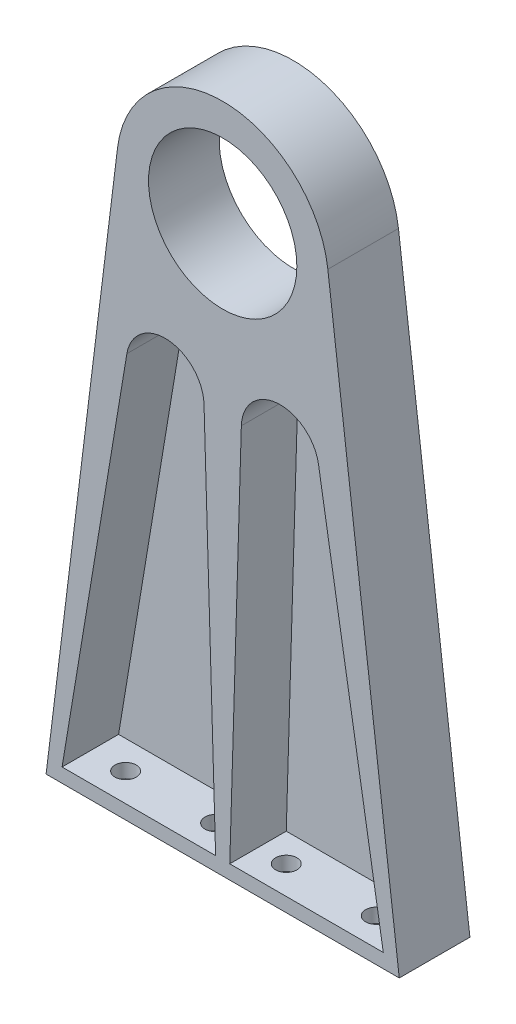
ISO-10303-21;
HEADER;
FILE_DESCRIPTION(('STEP AP214'),'2;1');
FILE_NAME('part.step','',(''),(''),'','','');
FILE_SCHEMA(('AUTOMOTIVE_DESIGN { 1 0 10303 214 1 1 1 1 }'));
ENDSEC;
DATA;
#1=APPLICATION_CONTEXT('core data for automotive mechanical design processes');
#2=APPLICATION_PROTOCOL_DEFINITION('international standard','automotive_design',2000,#1);
#3=PRODUCT_CONTEXT('',#1,'mechanical');
#4=PRODUCT('Part','Part','',(#3));
#5=PRODUCT_RELATED_PRODUCT_CATEGORY('part','',(#4));
#6=PRODUCT_DEFINITION_FORMATION('','',#4);
#7=PRODUCT_DEFINITION_CONTEXT('part definition',#1,'design');
#8=PRODUCT_DEFINITION('design','',#6,#7);
#9=PRODUCT_DEFINITION_SHAPE('','',#8);
#10=(LENGTH_UNIT() NAMED_UNIT(*) SI_UNIT(.MILLI.,.METRE.));
#11=(NAMED_UNIT(*) PLANE_ANGLE_UNIT() SI_UNIT($,.RADIAN.));
#12=(NAMED_UNIT(*) SI_UNIT($,.STERADIAN.) SOLID_ANGLE_UNIT());
#13=UNCERTAINTY_MEASURE_WITH_UNIT(LENGTH_MEASURE(1.E-05),#10,'distance_accuracy_value','');
#14=(GEOMETRIC_REPRESENTATION_CONTEXT(3) GLOBAL_UNCERTAINTY_ASSIGNED_CONTEXT((#13)) GLOBAL_UNIT_ASSIGNED_CONTEXT((#10,
#11,#12)) REPRESENTATION_CONTEXT('',''));
#15=CARTESIAN_POINT('',(0.,0.,0.));
#16=DIRECTION('',(0.,0.,1.));
#17=DIRECTION('',(1.,0.,0.));
#18=AXIS2_PLACEMENT_3D('',#15,#16,#17);
#19=CARTESIAN_POINT('',(5.02028973947688E-12,80.,10.));
#20=DIRECTION('',(0.,0.,1.));
#21=DIRECTION('',(1.,0.,0.));
#22=AXIS2_PLACEMENT_3D('',#19,#20,#21);
#23=PLANE('',#22);
#24=DIRECTION('',(1.,0.,0.));
#25=VECTOR('',#24,1.);
#26=CARTESIAN_POINT('',(-22.7376397365819,2.,10.));
#27=LINE('',#26,#25);
#28=CARTESIAN_POINT('',(-22.7376397365819,2.,10.));
#29=VERTEX_POINT('',#28);
#30=CARTESIAN_POINT('',(-1.00000000000001,2.00000000000002,10.));
#31=VERTEX_POINT('',#30);
#32=EDGE_CURVE('E49',#29,#31,#27,.T.);
#33=ORIENTED_EDGE('',*,*,#32,.F.);
#34=DIRECTION('',(-0.1637429725311,-0.986503035447271,0.));
#35=VECTOR('',#34,1.);
#36=CARTESIAN_POINT('',(-13.5649705563839,57.2626219589381,10.));
#37=LINE('',#36,#35);
#38=CARTESIAN_POINT('',(-13.5649705563839,57.2626219589381,10.));
#39=VERTEX_POINT('',#38);
#40=EDGE_CURVE('E143',#39,#29,#37,.T.);
#41=ORIENTED_EDGE('',*,*,#40,.F.);
#42=CARTESIAN_POINT('',(-8.13920386142391,56.3620356100171,10.));
#43=DIRECTION('',(0.,0.,1.));
#44=DIRECTION('',(1.,0.,0.));
#45=AXIS2_PLACEMENT_3D('',#42,#43,#44);
#46=CIRCLE('',#45,5.5);
#47=CARTESIAN_POINT('',(-2.64169495751029,56.5275525317818,10.));
#48=VERTEX_POINT('',#47);
#49=EDGE_CURVE('E146',#48,#39,#46,.T.);
#50=ORIENTED_EDGE('',*,*,#49,.F.);
#51=DIRECTION('',(-0.0300939857753978,0.99954707343884,0.));
#52=VECTOR('',#51,1.);
#53=CARTESIAN_POINT('',(-2.64169495751029,56.5275525317818,10.));
#54=LINE('',#53,#52);
#55=EDGE_CURVE('E155',#31,#48,#54,.T.);
#56=ORIENTED_EDGE('',*,*,#55,.F.);
#57=EDGE_LOOP('',(#33,#41,#50,#56));
#58=FACE_BOUND('',#57,.T.);
#59=DIRECTION('',(1.,0.,0.));
#60=VECTOR('',#59,1.);
#61=CARTESIAN_POINT('',(1.,2.,10.));
#62=LINE('',#61,#60);
#63=CARTESIAN_POINT('',(1.,2.,10.));
#64=VERTEX_POINT('',#63);
#65=CARTESIAN_POINT('',(22.7376397365822,2.,10.));
#66=VERTEX_POINT('',#65);
#67=EDGE_CURVE('E57',#64,#66,#62,.T.);
#68=ORIENTED_EDGE('',*,*,#67,.F.);
#69=DIRECTION('',(-0.0300939857755821,-0.999547073438835,0.));
#70=VECTOR('',#69,1.);
#71=CARTESIAN_POINT('',(2.64169495752037,56.5275525317828,10.));
#72=LINE('',#71,#70);
#73=CARTESIAN_POINT('',(2.64169495752037,56.5275525317828,10.));
#74=VERTEX_POINT('',#73);
#75=EDGE_CURVE('E169',#74,#64,#72,.T.);
#76=ORIENTED_EDGE('',*,*,#75,.F.);
#77=CARTESIAN_POINT('',(8.13920386143396,56.3620356100171,10.));
#78=DIRECTION('',(0.,0.,1.));
#79=DIRECTION('',(1.,0.,0.));
#80=AXIS2_PLACEMENT_3D('',#77,#78,#79);
#81=CIRCLE('',#80,5.5);
#82=CARTESIAN_POINT('',(13.5649705563941,57.2626219589372,10.));
#83=VERTEX_POINT('',#82);
#84=EDGE_CURVE('E183',#83,#74,#81,.T.);
#85=ORIENTED_EDGE('',*,*,#84,.F.);
#86=DIRECTION('',(-0.16374297253093,0.986503035447299,0.));
#87=VECTOR('',#86,1.);
#88=CARTESIAN_POINT('',(13.5649705563941,57.2626219589372,10.));
#89=LINE('',#88,#87);
#90=EDGE_CURVE('E180',#66,#83,#89,.T.);
#91=ORIENTED_EDGE('',*,*,#90,.F.);
#92=EDGE_LOOP('',(#68,#76,#85,#91));
#93=FACE_BOUND('',#92,.T.);
#94=DIRECTION('',(-0.122640969794791,0.992451103343532,0.));
#95=VECTOR('',#94,1.);
#96=CARTESIAN_POINT('',(25.,0.,10.));
#97=LINE('',#96,#95);
#98=CARTESIAN_POINT('',(25.,0.,10.));
#99=VERTEX_POINT('',#98);
#100=CARTESIAN_POINT('',(14.886766550158,81.8396145469219,10.));
#101=VERTEX_POINT('',#100);
#102=EDGE_CURVE('E202',#99,#101,#97,.T.);
#103=ORIENTED_EDGE('',*,*,#102,.T.);
#104=CARTESIAN_POINT('',(5.02028973947688E-12,80.,10.));
#105=DIRECTION('',(0.,0.,1.));
#106=DIRECTION('',(1.,0.,0.));
#107=AXIS2_PLACEMENT_3D('',#104,#105,#106);
#108=CIRCLE('',#107,15.);
#109=CARTESIAN_POINT('',(-14.8867665501477,81.8396145469237,10.));
#110=VERTEX_POINT('',#109);
#111=EDGE_CURVE('E205',#101,#110,#108,.T.);
#112=ORIENTED_EDGE('',*,*,#111,.T.);
#113=DIRECTION('',(-0.122640969794911,-0.992451103343517,0.));
#114=VECTOR('',#113,1.);
#115=CARTESIAN_POINT('',(-25.,0.,10.));
#116=LINE('',#115,#114);
#117=CARTESIAN_POINT('',(-25.,0.,10.));
#118=VERTEX_POINT('',#117);
#119=EDGE_CURVE('E208',#110,#118,#116,.T.);
#120=ORIENTED_EDGE('',*,*,#119,.T.);
#121=DIRECTION('',(1.,0.,0.));
#122=VECTOR('',#121,1.);
#123=CARTESIAN_POINT('',(-25.,0.,10.));
#124=LINE('',#123,#122);
#125=EDGE_CURVE('E210',#118,#99,#124,.T.);
#126=ORIENTED_EDGE('',*,*,#125,.T.);
#127=EDGE_LOOP('',(#103,#112,#120,#126));
#128=FACE_BOUND('',#127,.T.);
#129=CARTESIAN_POINT('',(5.02028973947688E-12,80.,10.));
#130=DIRECTION('',(0.,0.,1.));
#131=DIRECTION('',(1.,0.,0.));
#132=AXIS2_PLACEMENT_3D('',#129,#130,#131);
#133=CIRCLE('',#132,10.4999999999952);
#134=CARTESIAN_POINT('',(10.5000000000002,80.,10.));
#135=VERTEX_POINT('',#134);
#136=EDGE_CURVE('E196',#135,#135,#133,.T.);
#137=ORIENTED_EDGE('',*,*,#136,.F.);
#138=EDGE_LOOP('',(#137));
#139=FACE_BOUND('',#138,.T.);
#140=ADVANCED_FACE('F34',(#58,#93,#128,#139),#23,.T.);
#141=CARTESIAN_POINT('',(5.02028973947688E-12,80.,0.));
#142=DIRECTION('',(0.,0.,1.));
#143=DIRECTION('',(1.,0.,0.));
#144=AXIS2_PLACEMENT_3D('',#141,#142,#143);
#145=PLANE('',#144);
#146=DIRECTION('',(-0.122640969794791,0.992451103343532,0.));
#147=VECTOR('',#146,1.);
#148=CARTESIAN_POINT('',(25.,0.,0.));
#149=LINE('',#148,#147);
#150=CARTESIAN_POINT('',(25.,0.,0.));
#151=VERTEX_POINT('',#150);
#152=CARTESIAN_POINT('',(14.886766550158,81.8396145469219,0.));
#153=VERTEX_POINT('',#152);
#154=EDGE_CURVE('E199',#151,#153,#149,.T.);
#155=ORIENTED_EDGE('',*,*,#154,.F.);
#156=DIRECTION('',(1.,0.,0.));
#157=VECTOR('',#156,1.);
#158=CARTESIAN_POINT('',(-25.,0.,0.));
#159=LINE('',#158,#157);
#160=CARTESIAN_POINT('',(-25.,0.,0.));
#161=VERTEX_POINT('',#160);
#162=EDGE_CURVE('E206',#161,#151,#159,.T.);
#163=ORIENTED_EDGE('',*,*,#162,.F.);
#164=DIRECTION('',(-0.122640969794911,-0.992451103343517,0.));
#165=VECTOR('',#164,1.);
#166=CARTESIAN_POINT('',(-25.,0.,0.));
#167=LINE('',#166,#165);
#168=CARTESIAN_POINT('',(-14.8867665501477,81.8396145469237,0.));
#169=VERTEX_POINT('',#168);
#170=EDGE_CURVE('E217',#169,#161,#167,.T.);
#171=ORIENTED_EDGE('',*,*,#170,.F.);
#172=CARTESIAN_POINT('',(5.02028973947688E-12,80.,0.));
#173=DIRECTION('',(0.,0.,1.));
#174=DIRECTION('',(1.,0.,0.));
#175=AXIS2_PLACEMENT_3D('',#172,#173,#174);
#176=CIRCLE('',#175,15.);
#177=EDGE_CURVE('E215',#153,#169,#176,.T.);
#178=ORIENTED_EDGE('',*,*,#177,.F.);
#179=EDGE_LOOP('',(#155,#163,#171,#178));
#180=FACE_BOUND('',#179,.T.);
#181=CARTESIAN_POINT('',(5.02028973947688E-12,80.,0.));
#182=DIRECTION('',(0.,0.,1.));
#183=DIRECTION('',(1.,0.,0.));
#184=AXIS2_PLACEMENT_3D('',#181,#182,#183);
#185=CIRCLE('',#184,10.4999999999952);
#186=CARTESIAN_POINT('',(10.5000000000002,80.,0.));
#187=VERTEX_POINT('',#186);
#188=EDGE_CURVE('E190',#187,#187,#185,.T.);
#189=ORIENTED_EDGE('',*,*,#188,.T.);
#190=EDGE_LOOP('',(#189));
#191=FACE_BOUND('',#190,.T.);
#192=ADVANCED_FACE('F235',(#180,#191),#145,.F.);
#193=CARTESIAN_POINT('',(25.,0.,10.));
#194=DIRECTION('',(-0.992451103343532,-0.122640969794791,0.));
#195=DIRECTION('',(0.122640969794791,-0.992451103343532,0.));
#196=AXIS2_PLACEMENT_3D('',#193,#194,#195);
#197=PLANE('',#196);
#198=ORIENTED_EDGE('',*,*,#154,.T.);
#199=DIRECTION('',(0.,0.,-1.));
#200=VECTOR('',#199,1.);
#201=CARTESIAN_POINT('',(14.886766550158,81.8396145469219,10.));
#202=LINE('',#201,#200);
#203=EDGE_CURVE('E11',#101,#153,#202,.T.);
#204=ORIENTED_EDGE('',*,*,#203,.F.);
#205=ORIENTED_EDGE('',*,*,#102,.F.);
#206=DIRECTION('',(0.,0.,-1.));
#207=VECTOR('',#206,1.);
#208=CARTESIAN_POINT('',(25.,0.,10.));
#209=LINE('',#208,#207);
#210=EDGE_CURVE('E212',#99,#151,#209,.T.);
#211=ORIENTED_EDGE('',*,*,#210,.T.);
#212=EDGE_LOOP('',(#198,#204,#205,#211));
#213=FACE_BOUND('',#212,.T.);
#214=ADVANCED_FACE('F36',(#213),#197,.F.);
#215=CARTESIAN_POINT('',(5.02028973947688E-12,80.,10.));
#216=DIRECTION('',(0.,0.,-1.));
#217=DIRECTION('',(-1.,0.,0.));
#218=AXIS2_PLACEMENT_3D('',#215,#216,#217);
#219=CYLINDRICAL_SURFACE('',#218,15.);
#220=ORIENTED_EDGE('',*,*,#177,.T.);
#221=DIRECTION('',(0.,0.,-1.));
#222=VECTOR('',#221,1.);
#223=CARTESIAN_POINT('',(-14.8867665501477,81.8396145469237,10.));
#224=LINE('',#223,#222);
#225=EDGE_CURVE('E42',#110,#169,#224,.T.);
#226=ORIENTED_EDGE('',*,*,#225,.F.);
#227=ORIENTED_EDGE('',*,*,#111,.F.);
#228=ORIENTED_EDGE('',*,*,#203,.T.);
#229=EDGE_LOOP('',(#220,#226,#227,#228));
#230=FACE_BOUND('',#229,.T.);
#231=ADVANCED_FACE('F246',(#230),#219,.T.);
#232=CARTESIAN_POINT('',(-25.,0.,10.));
#233=DIRECTION('',(0.992451103343517,-0.122640969794911,0.));
#234=DIRECTION('',(0.122640969794911,0.992451103343517,0.));
#235=AXIS2_PLACEMENT_3D('',#232,#233,#234);
#236=PLANE('',#235);
#237=ORIENTED_EDGE('',*,*,#170,.T.);
#238=DIRECTION('',(0.,0.,-1.));
#239=VECTOR('',#238,1.);
#240=CARTESIAN_POINT('',(-25.,0.,10.));
#241=LINE('',#240,#239);
#242=EDGE_CURVE('E222',#118,#161,#241,.T.);
#243=ORIENTED_EDGE('',*,*,#242,.F.);
#244=ORIENTED_EDGE('',*,*,#119,.F.);
#245=ORIENTED_EDGE('',*,*,#225,.T.);
#246=EDGE_LOOP('',(#237,#243,#244,#245));
#247=FACE_BOUND('',#246,.T.);
#248=ADVANCED_FACE('F229',(#247),#236,.F.);
#249=CARTESIAN_POINT('',(-25.,0.,10.));
#250=DIRECTION('',(0.,1.,0.));
#251=DIRECTION('',(0.,0.,1.));
#252=AXIS2_PLACEMENT_3D('',#249,#250,#251);
#253=PLANE('',#252);
#254=CARTESIAN_POINT('',(-5.00000000000001,0.,6.));
#255=DIRECTION('',(0.,1.,0.));
#256=DIRECTION('',(-1.,0.,0.));
#257=AXIS2_PLACEMENT_3D('',#254,#255,#256);
#258=CIRCLE('',#257,1.5);
#259=CARTESIAN_POINT('',(-6.50000000000001,0.,6.));
#260=VERTEX_POINT('',#259);
#261=EDGE_CURVE('E275',#260,#260,#258,.T.);
#262=ORIENTED_EDGE('',*,*,#261,.T.);
#263=EDGE_LOOP('',(#262));
#264=FACE_BOUND('',#263,.T.);
#265=CARTESIAN_POINT('',(5.00000000000001,0.,6.));
#266=DIRECTION('',(0.,1.,0.));
#267=DIRECTION('',(-1.,0.,0.));
#268=AXIS2_PLACEMENT_3D('',#265,#266,#267);
#269=CIRCLE('',#268,1.5);
#270=CARTESIAN_POINT('',(3.5,0.,6.));
#271=VERTEX_POINT('',#270);
#272=EDGE_CURVE('E279',#271,#271,#269,.T.);
#273=ORIENTED_EDGE('',*,*,#272,.T.);
#274=EDGE_LOOP('',(#273));
#275=FACE_BOUND('',#274,.T.);
#276=CARTESIAN_POINT('',(17.74,0.,6.));
#277=DIRECTION('',(0.,1.,0.));
#278=DIRECTION('',(-1.,0.,0.));
#279=AXIS2_PLACEMENT_3D('',#276,#277,#278);
#280=CIRCLE('',#279,1.5);
#281=CARTESIAN_POINT('',(16.24,0.,6.));
#282=VERTEX_POINT('',#281);
#283=EDGE_CURVE('E283',#282,#282,#280,.T.);
#284=ORIENTED_EDGE('',*,*,#283,.T.);
#285=EDGE_LOOP('',(#284));
#286=FACE_BOUND('',#285,.T.);
#287=CARTESIAN_POINT('',(-17.74,0.,6.));
#288=DIRECTION('',(0.,1.,0.));
#289=DIRECTION('',(-1.,0.,0.));
#290=AXIS2_PLACEMENT_3D('',#287,#288,#289);
#291=CIRCLE('',#290,1.5);
#292=CARTESIAN_POINT('',(-19.24,0.,6.));
#293=VERTEX_POINT('',#292);
#294=EDGE_CURVE('E156',#293,#293,#291,.T.);
#295=ORIENTED_EDGE('',*,*,#294,.T.);
#296=EDGE_LOOP('',(#295));
#297=FACE_BOUND('',#296,.T.);
#298=ORIENTED_EDGE('',*,*,#162,.T.);
#299=ORIENTED_EDGE('',*,*,#210,.F.);
#300=ORIENTED_EDGE('',*,*,#125,.F.);
#301=ORIENTED_EDGE('',*,*,#242,.T.);
#302=EDGE_LOOP('',(#298,#299,#300,#301));
#303=FACE_BOUND('',#302,.T.);
#304=ADVANCED_FACE('F239',(#264,#275,#286,#297,#303),#253,.F.);
#305=CARTESIAN_POINT('',(5.02028973947688E-12,80.,10.));
#306=DIRECTION('',(0.,0.,-1.));
#307=DIRECTION('',(-1.,0.,0.));
#308=AXIS2_PLACEMENT_3D('',#305,#306,#307);
#309=CYLINDRICAL_SURFACE('',#308,10.4999999999952);
#310=ORIENTED_EDGE('',*,*,#136,.T.);
#311=EDGE_LOOP('',(#310));
#312=FACE_BOUND('',#311,.T.);
#313=ORIENTED_EDGE('',*,*,#188,.F.);
#314=EDGE_LOOP('',(#313));
#315=FACE_BOUND('',#314,.T.);
#316=ADVANCED_FACE('F262',(#312,#315),#309,.F.);
#317=CARTESIAN_POINT('',(1.,2.,2.));
#318=DIRECTION('',(0.,-1.,0.));
#319=DIRECTION('',(1.,0.,0.));
#320=AXIS2_PLACEMENT_3D('',#317,#318,#319);
#321=PLANE('',#320);
#322=CARTESIAN_POINT('',(5.,2.00000000000001,6.));
#323=DIRECTION('',(0.,1.,0.));
#324=DIRECTION('',(-1.,0.,0.));
#325=AXIS2_PLACEMENT_3D('',#322,#323,#324);
#326=CIRCLE('',#325,1.5);
#327=CARTESIAN_POINT('',(3.5,2.00000000000001,6.));
#328=VERTEX_POINT('',#327);
#329=EDGE_CURVE('E293',#328,#328,#326,.T.);
#330=ORIENTED_EDGE('',*,*,#329,.F.);
#331=EDGE_LOOP('',(#330));
#332=FACE_BOUND('',#331,.T.);
#333=CARTESIAN_POINT('',(17.74,2.00000000000001,6.));
#334=DIRECTION('',(0.,1.,0.));
#335=DIRECTION('',(-1.,0.,0.));
#336=AXIS2_PLACEMENT_3D('',#333,#334,#335);
#337=CIRCLE('',#336,1.5);
#338=CARTESIAN_POINT('',(16.24,2.00000000000001,6.));
#339=VERTEX_POINT('',#338);
#340=EDGE_CURVE('E289',#339,#339,#337,.T.);
#341=ORIENTED_EDGE('',*,*,#340,.F.);
#342=EDGE_LOOP('',(#341));
#343=FACE_BOUND('',#342,.T.);
#344=ORIENTED_EDGE('',*,*,#67,.T.);
#345=DIRECTION('',(0.,0.,1.));
#346=VECTOR('',#345,1.);
#347=CARTESIAN_POINT('',(22.7376397365822,2.,2.));
#348=LINE('',#347,#346);
#349=CARTESIAN_POINT('',(22.7376397365822,2.,2.));
#350=VERTEX_POINT('',#349);
#351=EDGE_CURVE('E178',#350,#66,#348,.T.);
#352=ORIENTED_EDGE('',*,*,#351,.F.);
#353=DIRECTION('',(1.,0.,0.));
#354=VECTOR('',#353,1.);
#355=CARTESIAN_POINT('',(1.,2.,2.));
#356=LINE('',#355,#354);
#357=CARTESIAN_POINT('',(1.,2.,2.));
#358=VERTEX_POINT('',#357);
#359=EDGE_CURVE('E165',#358,#350,#356,.T.);
#360=ORIENTED_EDGE('',*,*,#359,.F.);
#361=DIRECTION('',(0.,0.,1.));
#362=VECTOR('',#361,1.);
#363=CARTESIAN_POINT('',(1.,2.,2.));
#364=LINE('',#363,#362);
#365=EDGE_CURVE('E188',#358,#64,#364,.T.);
#366=ORIENTED_EDGE('',*,*,#365,.T.);
#367=EDGE_LOOP('',(#344,#352,#360,#366));
#368=FACE_BOUND('',#367,.T.);
#369=ADVANCED_FACE('F270',(#332,#343,#368),#321,.F.);
#370=CARTESIAN_POINT('',(2.64169495752037,56.5275525317828,2.));
#371=DIRECTION('',(-0.999547073438835,0.0300939857755821,0.));
#372=DIRECTION('',(-0.0300939857755821,-0.999547073438835,0.));
#373=AXIS2_PLACEMENT_3D('',#370,#371,#372);
#374=PLANE('',#373);
#375=ORIENTED_EDGE('',*,*,#75,.T.);
#376=ORIENTED_EDGE('',*,*,#365,.F.);
#377=DIRECTION('',(-0.0300939857755821,-0.999547073438835,0.));
#378=VECTOR('',#377,1.);
#379=CARTESIAN_POINT('',(2.64169495752037,56.5275525317828,2.));
#380=LINE('',#379,#378);
#381=CARTESIAN_POINT('',(2.64169495752037,56.5275525317828,2.));
#382=VERTEX_POINT('',#381);
#383=EDGE_CURVE('E175',#382,#358,#380,.T.);
#384=ORIENTED_EDGE('',*,*,#383,.F.);
#385=DIRECTION('',(0.,0.,1.));
#386=VECTOR('',#385,1.);
#387=CARTESIAN_POINT('',(2.64169495752037,56.5275525317828,2.));
#388=LINE('',#387,#386);
#389=EDGE_CURVE('E191',#382,#74,#388,.T.);
#390=ORIENTED_EDGE('',*,*,#389,.T.);
#391=EDGE_LOOP('',(#375,#376,#384,#390));
#392=FACE_BOUND('',#391,.T.);
#393=ADVANCED_FACE('F338',(#392),#374,.F.);
#394=CARTESIAN_POINT('',(8.13920386143396,56.3620356100171,2.));
#395=DIRECTION('',(0.,0.,1.));
#396=DIRECTION('',(1.,0.,0.));
#397=AXIS2_PLACEMENT_3D('',#394,#395,#396);
#398=CYLINDRICAL_SURFACE('',#397,5.5);
#399=ORIENTED_EDGE('',*,*,#84,.T.);
#400=ORIENTED_EDGE('',*,*,#389,.F.);
#401=CARTESIAN_POINT('',(8.13920386143396,56.3620356100171,2.));
#402=DIRECTION('',(0.,0.,1.));
#403=DIRECTION('',(1.,0.,0.));
#404=AXIS2_PLACEMENT_3D('',#401,#402,#403);
#405=CIRCLE('',#404,5.5);
#406=CARTESIAN_POINT('',(13.5649705563941,57.2626219589372,2.));
#407=VERTEX_POINT('',#406);
#408=EDGE_CURVE('E172',#407,#382,#405,.T.);
#409=ORIENTED_EDGE('',*,*,#408,.F.);
#410=DIRECTION('',(0.,0.,1.));
#411=VECTOR('',#410,1.);
#412=CARTESIAN_POINT('',(13.5649705563941,57.2626219589372,2.));
#413=LINE('',#412,#411);
#414=EDGE_CURVE('E193',#407,#83,#413,.T.);
#415=ORIENTED_EDGE('',*,*,#414,.T.);
#416=EDGE_LOOP('',(#399,#400,#409,#415));
#417=FACE_BOUND('',#416,.T.);
#418=ADVANCED_FACE('F341',(#417),#398,.F.);
#419=CARTESIAN_POINT('',(13.5649705563941,57.2626219589372,2.));
#420=DIRECTION('',(0.986503035447299,0.16374297253093,0.));
#421=DIRECTION('',(-0.16374297253093,0.986503035447299,0.));
#422=AXIS2_PLACEMENT_3D('',#419,#420,#421);
#423=PLANE('',#422);
#424=ORIENTED_EDGE('',*,*,#90,.T.);
#425=ORIENTED_EDGE('',*,*,#414,.F.);
#426=DIRECTION('',(-0.16374297253093,0.986503035447299,0.));
#427=VECTOR('',#426,1.);
#428=CARTESIAN_POINT('',(13.5649705563941,57.2626219589372,2.));
#429=LINE('',#428,#427);
#430=EDGE_CURVE('E168',#350,#407,#429,.T.);
#431=ORIENTED_EDGE('',*,*,#430,.F.);
#432=ORIENTED_EDGE('',*,*,#351,.T.);
#433=EDGE_LOOP('',(#424,#425,#431,#432));
#434=FACE_BOUND('',#433,.T.);
#435=ADVANCED_FACE('F336',(#434),#423,.F.);
#436=CARTESIAN_POINT('',(8.13920386143396,56.3620356100171,2.));
#437=DIRECTION('',(0.,0.,1.));
#438=DIRECTION('',(1.,0.,0.));
#439=AXIS2_PLACEMENT_3D('',#436,#437,#438);
#440=PLANE('',#439);
#441=ORIENTED_EDGE('',*,*,#359,.T.);
#442=ORIENTED_EDGE('',*,*,#430,.T.);
#443=ORIENTED_EDGE('',*,*,#408,.T.);
#444=ORIENTED_EDGE('',*,*,#383,.T.);
#445=EDGE_LOOP('',(#441,#442,#443,#444));
#446=FACE_BOUND('',#445,.T.);
#447=ADVANCED_FACE('F307',(#446),#440,.T.);
#448=CARTESIAN_POINT('',(-22.7376397365819,2.,2.));
#449=DIRECTION('',(0.,-1.,0.));
#450=DIRECTION('',(1.,0.,0.));
#451=AXIS2_PLACEMENT_3D('',#448,#449,#450);
#452=PLANE('',#451);
#453=CARTESIAN_POINT('',(-5.00000000000002,2.00000000000001,6.));
#454=DIRECTION('',(0.,1.,0.));
#455=DIRECTION('',(-1.,0.,0.));
#456=AXIS2_PLACEMENT_3D('',#453,#454,#455);
#457=CIRCLE('',#456,1.5);
#458=CARTESIAN_POINT('',(-6.50000000000002,2.00000000000001,6.));
#459=VERTEX_POINT('',#458);
#460=EDGE_CURVE('E297',#459,#459,#457,.T.);
#461=ORIENTED_EDGE('',*,*,#460,.F.);
#462=EDGE_LOOP('',(#461));
#463=FACE_BOUND('',#462,.T.);
#464=CARTESIAN_POINT('',(-17.74,2.,6.));
#465=DIRECTION('',(0.,1.,0.));
#466=DIRECTION('',(-1.,0.,0.));
#467=AXIS2_PLACEMENT_3D('',#464,#465,#466);
#468=CIRCLE('',#467,1.5);
#469=CARTESIAN_POINT('',(-19.24,2.,6.));
#470=VERTEX_POINT('',#469);
#471=EDGE_CURVE('E149',#470,#470,#468,.T.);
#472=ORIENTED_EDGE('',*,*,#471,.F.);
#473=EDGE_LOOP('',(#472));
#474=FACE_BOUND('',#473,.T.);
#475=ORIENTED_EDGE('',*,*,#32,.T.);
#476=DIRECTION('',(0.,0.,1.));
#477=VECTOR('',#476,1.);
#478=CARTESIAN_POINT('',(-1.00000000000001,2.00000000000001,2.));
#479=LINE('',#478,#477);
#480=CARTESIAN_POINT('',(-1.00000000000001,2.00000000000001,2.));
#481=VERTEX_POINT('',#480);
#482=EDGE_CURVE('E121',#481,#31,#479,.T.);
#483=ORIENTED_EDGE('',*,*,#482,.F.);
#484=DIRECTION('',(1.,0.,0.));
#485=VECTOR('',#484,1.);
#486=CARTESIAN_POINT('',(-22.7376397365819,2.,2.));
#487=LINE('',#486,#485);
#488=CARTESIAN_POINT('',(-22.7376397365819,2.,2.));
#489=VERTEX_POINT('',#488);
#490=EDGE_CURVE('E125',#489,#481,#487,.T.);
#491=ORIENTED_EDGE('',*,*,#490,.F.);
#492=DIRECTION('',(0.,0.,1.));
#493=VECTOR('',#492,1.);
#494=CARTESIAN_POINT('',(-22.7376397365819,2.,2.));
#495=LINE('',#494,#493);
#496=EDGE_CURVE('E160',#489,#29,#495,.T.);
#497=ORIENTED_EDGE('',*,*,#496,.T.);
#498=EDGE_LOOP('',(#475,#483,#491,#497));
#499=FACE_BOUND('',#498,.T.);
#500=ADVANCED_FACE('F123',(#463,#474,#499),#452,.F.);
#501=CARTESIAN_POINT('',(-13.5649705563839,57.2626219589381,2.));
#502=DIRECTION('',(-0.986503035447271,0.1637429725311,0.));
#503=DIRECTION('',(-0.1637429725311,-0.986503035447271,0.));
#504=AXIS2_PLACEMENT_3D('',#501,#502,#503);
#505=PLANE('',#504);
#506=ORIENTED_EDGE('',*,*,#40,.T.);
#507=ORIENTED_EDGE('',*,*,#496,.F.);
#508=DIRECTION('',(-0.1637429725311,-0.986503035447271,0.));
#509=VECTOR('',#508,1.);
#510=CARTESIAN_POINT('',(-13.5649705563839,57.2626219589381,2.));
#511=LINE('',#510,#509);
#512=CARTESIAN_POINT('',(-13.5649705563839,57.2626219589381,2.));
#513=VERTEX_POINT('',#512);
#514=EDGE_CURVE('E131',#513,#489,#511,.T.);
#515=ORIENTED_EDGE('',*,*,#514,.F.);
#516=DIRECTION('',(0.,0.,1.));
#517=VECTOR('',#516,1.);
#518=CARTESIAN_POINT('',(-13.5649705563839,57.2626219589381,2.));
#519=LINE('',#518,#517);
#520=EDGE_CURVE('E162',#513,#39,#519,.T.);
#521=ORIENTED_EDGE('',*,*,#520,.T.);
#522=EDGE_LOOP('',(#506,#507,#515,#521));
#523=FACE_BOUND('',#522,.T.);
#524=ADVANCED_FACE('F306',(#523),#505,.F.);
#525=CARTESIAN_POINT('',(-8.13920386142391,56.3620356100171,2.));
#526=DIRECTION('',(0.,0.,1.));
#527=DIRECTION('',(1.,0.,0.));
#528=AXIS2_PLACEMENT_3D('',#525,#526,#527);
#529=CYLINDRICAL_SURFACE('',#528,5.5);
#530=ORIENTED_EDGE('',*,*,#49,.T.);
#531=ORIENTED_EDGE('',*,*,#520,.F.);
#532=CARTESIAN_POINT('',(-8.13920386142391,56.3620356100171,2.));
#533=DIRECTION('',(0.,0.,1.));
#534=DIRECTION('',(1.,0.,0.));
#535=AXIS2_PLACEMENT_3D('',#532,#533,#534);
#536=CIRCLE('',#535,5.5);
#537=CARTESIAN_POINT('',(-2.64169495751029,56.5275525317818,2.));
#538=VERTEX_POINT('',#537);
#539=EDGE_CURVE('E139',#538,#513,#536,.T.);
#540=ORIENTED_EDGE('',*,*,#539,.F.);
#541=DIRECTION('',(0.,0.,1.));
#542=VECTOR('',#541,1.);
#543=CARTESIAN_POINT('',(-2.64169495751029,56.5275525317818,2.));
#544=LINE('',#543,#542);
#545=EDGE_CURVE('E130',#538,#48,#544,.T.);
#546=ORIENTED_EDGE('',*,*,#545,.T.);
#547=EDGE_LOOP('',(#530,#531,#540,#546));
#548=FACE_BOUND('',#547,.T.);
#549=ADVANCED_FACE('F327',(#548),#529,.F.);
#550=CARTESIAN_POINT('',(-2.64169495751029,56.5275525317818,2.));
#551=DIRECTION('',(0.99954707343884,0.0300939857753978,0.));
#552=DIRECTION('',(-0.0300939857753978,0.99954707343884,0.));
#553=AXIS2_PLACEMENT_3D('',#550,#551,#552);
#554=PLANE('',#553);
#555=ORIENTED_EDGE('',*,*,#55,.T.);
#556=ORIENTED_EDGE('',*,*,#545,.F.);
#557=DIRECTION('',(-0.0300939857753978,0.99954707343884,0.));
#558=VECTOR('',#557,1.);
#559=CARTESIAN_POINT('',(-2.64169495751029,56.5275525317818,2.));
#560=LINE('',#559,#558);
#561=EDGE_CURVE('E134',#481,#538,#560,.T.);
#562=ORIENTED_EDGE('',*,*,#561,.F.);
#563=ORIENTED_EDGE('',*,*,#482,.T.);
#564=EDGE_LOOP('',(#555,#556,#562,#563));
#565=FACE_BOUND('',#564,.T.);
#566=ADVANCED_FACE('F135',(#565),#554,.F.);
#567=CARTESIAN_POINT('',(-8.13920386142391,56.3620356100171,2.));
#568=DIRECTION('',(0.,0.,1.));
#569=DIRECTION('',(1.,0.,0.));
#570=AXIS2_PLACEMENT_3D('',#567,#568,#569);
#571=PLANE('',#570);
#572=ORIENTED_EDGE('',*,*,#490,.T.);
#573=ORIENTED_EDGE('',*,*,#561,.T.);
#574=ORIENTED_EDGE('',*,*,#539,.T.);
#575=ORIENTED_EDGE('',*,*,#514,.T.);
#576=EDGE_LOOP('',(#572,#573,#574,#575));
#577=FACE_BOUND('',#576,.T.);
#578=ADVANCED_FACE('F141',(#577),#571,.T.);
#579=CARTESIAN_POINT('',(-17.74,0.,6.));
#580=DIRECTION('',(0.,1.,0.));
#581=DIRECTION('',(-1.,0.,0.));
#582=AXIS2_PLACEMENT_3D('',#579,#580,#581);
#583=CYLINDRICAL_SURFACE('',#582,1.5);
#584=ORIENTED_EDGE('',*,*,#294,.F.);
#585=EDGE_LOOP('',(#584));
#586=FACE_BOUND('',#585,.T.);
#587=ORIENTED_EDGE('',*,*,#471,.T.);
#588=EDGE_LOOP('',(#587));
#589=FACE_BOUND('',#588,.T.);
#590=ADVANCED_FACE('F311',(#586,#589),#583,.F.);
#591=CARTESIAN_POINT('',(-5.00000000000001,0.,6.));
#592=DIRECTION('',(0.,1.,0.));
#593=DIRECTION('',(-1.,0.,0.));
#594=AXIS2_PLACEMENT_3D('',#591,#592,#593);
#595=CYLINDRICAL_SURFACE('',#594,1.5);
#596=ORIENTED_EDGE('',*,*,#261,.F.);
#597=EDGE_LOOP('',(#596));
#598=FACE_BOUND('',#597,.T.);
#599=ORIENTED_EDGE('',*,*,#460,.T.);
#600=EDGE_LOOP('',(#599));
#601=FACE_BOUND('',#600,.T.);
#602=ADVANCED_FACE('F302',(#598,#601),#595,.F.);
#603=CARTESIAN_POINT('',(17.74,0.,6.));
#604=DIRECTION('',(0.,1.,0.));
#605=DIRECTION('',(-1.,0.,0.));
#606=AXIS2_PLACEMENT_3D('',#603,#604,#605);
#607=CYLINDRICAL_SURFACE('',#606,1.5);
#608=ORIENTED_EDGE('',*,*,#283,.F.);
#609=EDGE_LOOP('',(#608));
#610=FACE_BOUND('',#609,.T.);
#611=ORIENTED_EDGE('',*,*,#340,.T.);
#612=EDGE_LOOP('',(#611));
#613=FACE_BOUND('',#612,.T.);
#614=ADVANCED_FACE('F318',(#610,#613),#607,.F.);
#615=CARTESIAN_POINT('',(5.00000000000001,0.,6.));
#616=DIRECTION('',(0.,1.,0.));
#617=DIRECTION('',(-1.,0.,0.));
#618=AXIS2_PLACEMENT_3D('',#615,#616,#617);
#619=CYLINDRICAL_SURFACE('',#618,1.5);
#620=ORIENTED_EDGE('',*,*,#272,.F.);
#621=EDGE_LOOP('',(#620));
#622=FACE_BOUND('',#621,.T.);
#623=ORIENTED_EDGE('',*,*,#329,.T.);
#624=EDGE_LOOP('',(#623));
#625=FACE_BOUND('',#624,.T.);
#626=ADVANCED_FACE('F357',(#622,#625),#619,.F.);
#627=CLOSED_SHELL('',(#140,#192,#214,#231,#248,#304,#316,#369,#393,#418,#435,#447,#500,#524,
#549,#566,#578,#590,#602,#614,#626));
#628=MANIFOLD_SOLID_BREP('B2',#627);
#629=ADVANCED_BREP_SHAPE_REPRESENTATION('',(#18,#628),#14);
#630=SHAPE_DEFINITION_REPRESENTATION(#9,#629);
ENDSEC;
END-ISO-10303-21;
